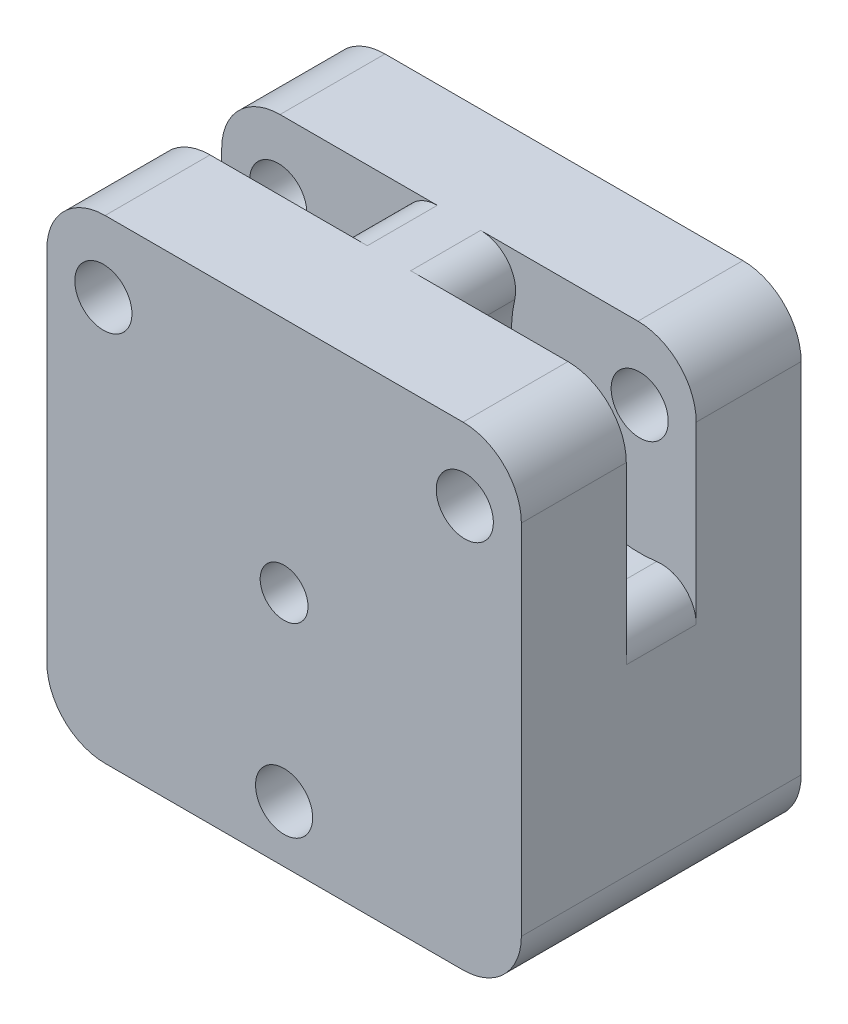
ISO-10303-21;
HEADER;
FILE_DESCRIPTION(('STEP AP214'),'2;1');
FILE_NAME('part.step','',(''),(''),'','','');
FILE_SCHEMA(('AUTOMOTIVE_DESIGN { 1 0 10303 214 1 1 1 1 }'));
ENDSEC;
DATA;
#1=APPLICATION_CONTEXT('core data for automotive mechanical design processes');
#2=APPLICATION_PROTOCOL_DEFINITION('international standard','automotive_design',2000,#1);
#3=PRODUCT_CONTEXT('',#1,'mechanical');
#4=PRODUCT('Part','Part','',(#3));
#5=PRODUCT_RELATED_PRODUCT_CATEGORY('part','',(#4));
#6=PRODUCT_DEFINITION_FORMATION('','',#4);
#7=PRODUCT_DEFINITION_CONTEXT('part definition',#1,'design');
#8=PRODUCT_DEFINITION('design','',#6,#7);
#9=PRODUCT_DEFINITION_SHAPE('','',#8);
#10=(LENGTH_UNIT() NAMED_UNIT(*) SI_UNIT(.MILLI.,.METRE.));
#11=(NAMED_UNIT(*) PLANE_ANGLE_UNIT() SI_UNIT($,.RADIAN.));
#12=(NAMED_UNIT(*) SI_UNIT($,.STERADIAN.) SOLID_ANGLE_UNIT());
#13=UNCERTAINTY_MEASURE_WITH_UNIT(LENGTH_MEASURE(1.E-05),#10,'distance_accuracy_value','');
#14=(GEOMETRIC_REPRESENTATION_CONTEXT(3) GLOBAL_UNCERTAINTY_ASSIGNED_CONTEXT((#13)) GLOBAL_UNIT_ASSIGNED_CONTEXT((#10,
#11,#12)) REPRESENTATION_CONTEXT('',''));
#15=CARTESIAN_POINT('',(0.,0.,0.));
#16=DIRECTION('',(0.,0.,1.));
#17=DIRECTION('',(1.,0.,0.));
#18=AXIS2_PLACEMENT_3D('',#15,#16,#17);
#19=CARTESIAN_POINT('',(0.,20.35,24.));
#20=DIRECTION('',(0.,1.,0.));
#21=DIRECTION('',(0.,0.,1.));
#22=AXIS2_PLACEMENT_3D('',#19,#20,#21);
#23=PLANE('',#22);
#24=DIRECTION('',(1.,0.,0.));
#25=VECTOR('',#24,1.);
#26=CARTESIAN_POINT('',(0.,20.35,9.));
#27=LINE('',#26,#25);
#28=CARTESIAN_POINT('',(-15.35,20.35,9.));
#29=VERTEX_POINT('',#28);
#30=CARTESIAN_POINT('',(-1.85886725659874,20.35,9.));
#31=VERTEX_POINT('',#30);
#32=EDGE_CURVE('E50',#29,#31,#27,.T.);
#33=ORIENTED_EDGE('',*,*,#32,.T.);
#34=DIRECTION('',(0.,0.,-1.));
#35=VECTOR('',#34,1.);
#36=CARTESIAN_POINT('',(-1.85886725659874,20.35,15.));
#37=LINE('',#36,#35);
#38=CARTESIAN_POINT('',(-1.85886725659874,20.35,15.));
#39=VERTEX_POINT('',#38);
#40=EDGE_CURVE('E298',#31,#39,#37,.F.);
#41=ORIENTED_EDGE('',*,*,#40,.T.);
#42=DIRECTION('',(1.,0.,0.));
#43=VECTOR('',#42,1.);
#44=CARTESIAN_POINT('',(0.,20.35,15.));
#45=LINE('',#44,#43);
#46=CARTESIAN_POINT('',(-15.35,20.35,15.));
#47=VERTEX_POINT('',#46);
#48=EDGE_CURVE('E58',#47,#39,#45,.T.);
#49=ORIENTED_EDGE('',*,*,#48,.F.);
#50=DIRECTION('',(0.,0.,-1.));
#51=VECTOR('',#50,1.);
#52=CARTESIAN_POINT('',(-15.35,20.35,24.));
#53=LINE('',#52,#51);
#54=CARTESIAN_POINT('',(-15.35,20.35,24.));
#55=VERTEX_POINT('',#54);
#56=EDGE_CURVE('E205',#55,#47,#53,.T.);
#57=ORIENTED_EDGE('',*,*,#56,.F.);
#58=DIRECTION('',(1.,0.,0.));
#59=VECTOR('',#58,1.);
#60=CARTESIAN_POINT('',(0.,20.35,24.));
#61=LINE('',#60,#59);
#62=CARTESIAN_POINT('',(15.35,20.35,24.));
#63=VERTEX_POINT('',#62);
#64=EDGE_CURVE('E348',#55,#63,#61,.T.);
#65=ORIENTED_EDGE('',*,*,#64,.T.);
#66=DIRECTION('',(0.,0.,-1.));
#67=VECTOR('',#66,1.);
#68=CARTESIAN_POINT('',(15.35,20.35,24.));
#69=LINE('',#68,#67);
#70=CARTESIAN_POINT('',(15.35,20.35,15.));
#71=VERTEX_POINT('',#70);
#72=EDGE_CURVE('E227',#63,#71,#69,.T.);
#73=ORIENTED_EDGE('',*,*,#72,.T.);
#74=DIRECTION('',(1.,0.,0.));
#75=VECTOR('',#74,1.);
#76=CARTESIAN_POINT('',(0.,20.35,15.));
#77=LINE('',#76,#75);
#78=CARTESIAN_POINT('',(1.85886725659874,20.35,15.));
#79=VERTEX_POINT('',#78);
#80=EDGE_CURVE('E200',#79,#71,#77,.T.);
#81=ORIENTED_EDGE('',*,*,#80,.F.);
#82=DIRECTION('',(0.,0.,-1.));
#83=VECTOR('',#82,1.);
#84=CARTESIAN_POINT('',(1.85886725659874,20.35,9.));
#85=LINE('',#84,#83);
#86=CARTESIAN_POINT('',(1.85886725659874,20.35,9.));
#87=VERTEX_POINT('',#86);
#88=EDGE_CURVE('E295',#79,#87,#85,.T.);
#89=ORIENTED_EDGE('',*,*,#88,.T.);
#90=DIRECTION('',(1.,0.,0.));
#91=VECTOR('',#90,1.);
#92=CARTESIAN_POINT('',(0.,20.35,9.));
#93=LINE('',#92,#91);
#94=CARTESIAN_POINT('',(15.35,20.35,9.));
#95=VERTEX_POINT('',#94);
#96=EDGE_CURVE('E331',#87,#95,#93,.T.);
#97=ORIENTED_EDGE('',*,*,#96,.T.);
#98=CARTESIAN_POINT('',(15.35,20.35,0.));
#99=VERTEX_POINT('',#98);
#100=EDGE_CURVE('E370',#95,#99,#69,.T.);
#101=ORIENTED_EDGE('',*,*,#100,.T.);
#102=DIRECTION('',(1.,0.,0.));
#103=VECTOR('',#102,1.);
#104=CARTESIAN_POINT('',(0.,20.35,0.));
#105=LINE('',#104,#103);
#106=CARTESIAN_POINT('',(-15.35,20.35,0.));
#107=VERTEX_POINT('',#106);
#108=EDGE_CURVE('E347',#107,#99,#105,.T.);
#109=ORIENTED_EDGE('',*,*,#108,.F.);
#110=EDGE_CURVE('E241',#29,#107,#53,.T.);
#111=ORIENTED_EDGE('',*,*,#110,.F.);
#112=EDGE_LOOP('',(#33,#41,#49,#57,#65,#73,#81,#89,#97,#101,#109,#111));
#113=FACE_BOUND('',#112,.T.);
#114=ADVANCED_FACE('F35',(#113),#23,.T.);
#115=CARTESIAN_POINT('',(-15.35,15.35,24.));
#116=DIRECTION('',(0.,0.,-1.));
#117=DIRECTION('',(-1.,0.,0.));
#118=AXIS2_PLACEMENT_3D('',#115,#116,#117);
#119=CYLINDRICAL_SURFACE('',#118,5.);
#120=DIRECTION('',(0.,0.,-1.));
#121=VECTOR('',#120,1.);
#122=CARTESIAN_POINT('',(-20.35,15.35,24.));
#123=LINE('',#122,#121);
#124=CARTESIAN_POINT('',(-20.35,15.35,9.));
#125=VERTEX_POINT('',#124);
#126=CARTESIAN_POINT('',(-20.35,15.35,0.));
#127=VERTEX_POINT('',#126);
#128=EDGE_CURVE('E237',#125,#127,#123,.T.);
#129=ORIENTED_EDGE('',*,*,#128,.F.);
#130=CARTESIAN_POINT('',(-15.35,15.35,9.));
#131=DIRECTION('',(0.,0.,1.));
#132=DIRECTION('',(1.,0.,0.));
#133=AXIS2_PLACEMENT_3D('',#130,#131,#132);
#134=CIRCLE('',#133,5.);
#135=EDGE_CURVE('E343',#125,#29,#134,.F.);
#136=ORIENTED_EDGE('',*,*,#135,.T.);
#137=ORIENTED_EDGE('',*,*,#110,.T.);
#138=CARTESIAN_POINT('',(-15.35,15.35,0.));
#139=DIRECTION('',(0.,0.,1.));
#140=DIRECTION('',(1.,0.,0.));
#141=AXIS2_PLACEMENT_3D('',#138,#139,#140);
#142=CIRCLE('',#141,5.);
#143=EDGE_CURVE('E373',#127,#107,#142,.F.);
#144=ORIENTED_EDGE('',*,*,#143,.F.);
#145=EDGE_LOOP('',(#129,#136,#137,#144));
#146=FACE_BOUND('',#145,.T.);
#147=ADVANCED_FACE('F412',(#146),#119,.T.);
#148=CARTESIAN_POINT('',(-20.35,0.,24.));
#149=DIRECTION('',(-1.,0.,0.));
#150=DIRECTION('',(0.,0.,1.));
#151=AXIS2_PLACEMENT_3D('',#148,#149,#150);
#152=PLANE('',#151);
#153=DIRECTION('',(0.,1.,0.));
#154=VECTOR('',#153,1.);
#155=CARTESIAN_POINT('',(-20.35,0.,15.));
#156=LINE('',#155,#154);
#157=CARTESIAN_POINT('',(-20.35,0.323247076428234,15.));
#158=VERTEX_POINT('',#157);
#159=CARTESIAN_POINT('',(-20.35,15.35,15.));
#160=VERTEX_POINT('',#159);
#161=EDGE_CURVE('E250',#158,#160,#156,.T.);
#162=ORIENTED_EDGE('',*,*,#161,.F.);
#163=DIRECTION('',(0.,0.,-1.));
#164=VECTOR('',#163,1.);
#165=CARTESIAN_POINT('',(-20.35,0.323247076428234,9.));
#166=LINE('',#165,#164);
#167=CARTESIAN_POINT('',(-20.35,0.323247076428234,9.));
#168=VERTEX_POINT('',#167);
#169=EDGE_CURVE('E286',#158,#168,#166,.T.);
#170=ORIENTED_EDGE('',*,*,#169,.T.);
#171=DIRECTION('',(0.,1.,0.));
#172=VECTOR('',#171,1.);
#173=CARTESIAN_POINT('',(-20.35,0.,9.));
#174=LINE('',#173,#172);
#175=EDGE_CURVE('E252',#168,#125,#174,.T.);
#176=ORIENTED_EDGE('',*,*,#175,.T.);
#177=ORIENTED_EDGE('',*,*,#128,.T.);
#178=DIRECTION('',(0.,1.,0.));
#179=VECTOR('',#178,1.);
#180=CARTESIAN_POINT('',(-20.35,0.,0.));
#181=LINE('',#180,#179);
#182=CARTESIAN_POINT('',(-20.35,-15.35,0.));
#183=VERTEX_POINT('',#182);
#184=EDGE_CURVE('E376',#183,#127,#181,.T.);
#185=ORIENTED_EDGE('',*,*,#184,.F.);
#186=DIRECTION('',(0.,0.,-1.));
#187=VECTOR('',#186,1.);
#188=CARTESIAN_POINT('',(-20.35,-15.35,24.));
#189=LINE('',#188,#187);
#190=CARTESIAN_POINT('',(-20.35,-15.35,24.));
#191=VERTEX_POINT('',#190);
#192=EDGE_CURVE('E235',#191,#183,#189,.T.);
#193=ORIENTED_EDGE('',*,*,#192,.F.);
#194=DIRECTION('',(0.,1.,0.));
#195=VECTOR('',#194,1.);
#196=CARTESIAN_POINT('',(-20.35,0.,24.));
#197=LINE('',#196,#195);
#198=CARTESIAN_POINT('',(-20.35,15.35,24.));
#199=VERTEX_POINT('',#198);
#200=EDGE_CURVE('E354',#191,#199,#197,.T.);
#201=ORIENTED_EDGE('',*,*,#200,.T.);
#202=EDGE_CURVE('E238',#199,#160,#123,.T.);
#203=ORIENTED_EDGE('',*,*,#202,.T.);
#204=EDGE_LOOP('',(#162,#170,#176,#177,#185,#193,#201,#203));
#205=FACE_BOUND('',#204,.T.);
#206=ADVANCED_FACE('F419',(#205),#152,.T.);
#207=CARTESIAN_POINT('',(0.,-20.35,24.));
#208=DIRECTION('',(0.,1.,0.));
#209=DIRECTION('',(0.,0.,1.));
#210=AXIS2_PLACEMENT_3D('',#207,#208,#209);
#211=PLANE('',#210);
#212=DIRECTION('',(1.,0.,0.));
#213=VECTOR('',#212,1.);
#214=CARTESIAN_POINT('',(0.,-20.35,0.));
#215=LINE('',#214,#213);
#216=CARTESIAN_POINT('',(-15.35,-20.35,0.));
#217=VERTEX_POINT('',#216);
#218=CARTESIAN_POINT('',(15.35,-20.35,0.));
#219=VERTEX_POINT('',#218);
#220=EDGE_CURVE('E382',#217,#219,#215,.T.);
#221=ORIENTED_EDGE('',*,*,#220,.T.);
#222=DIRECTION('',(0.,0.,-1.));
#223=VECTOR('',#222,1.);
#224=CARTESIAN_POINT('',(15.35,-20.35,24.));
#225=LINE('',#224,#223);
#226=CARTESIAN_POINT('',(15.35,-20.35,24.));
#227=VERTEX_POINT('',#226);
#228=EDGE_CURVE('E225',#227,#219,#225,.T.);
#229=ORIENTED_EDGE('',*,*,#228,.F.);
#230=DIRECTION('',(1.,0.,0.));
#231=VECTOR('',#230,1.);
#232=CARTESIAN_POINT('',(0.,-20.35,24.));
#233=LINE('',#232,#231);
#234=CARTESIAN_POINT('',(-15.35,-20.35,24.));
#235=VERTEX_POINT('',#234);
#236=EDGE_CURVE('E360',#235,#227,#233,.T.);
#237=ORIENTED_EDGE('',*,*,#236,.F.);
#238=DIRECTION('',(0.,0.,-1.));
#239=VECTOR('',#238,1.);
#240=CARTESIAN_POINT('',(-15.35,-20.35,24.));
#241=LINE('',#240,#239);
#242=EDGE_CURVE('E233',#235,#217,#241,.T.);
#243=ORIENTED_EDGE('',*,*,#242,.T.);
#244=EDGE_LOOP('',(#221,#229,#237,#243));
#245=FACE_BOUND('',#244,.T.);
#246=DIRECTION('',(0.,0.,1.));
#247=VECTOR('',#246,1.);
#248=CARTESIAN_POINT('',(-13.8772295505983,-20.35,24.));
#249=LINE('',#248,#247);
#250=CARTESIAN_POINT('',(-13.8772295505983,-20.35,9.));
#251=VERTEX_POINT('',#250);
#252=CARTESIAN_POINT('',(-13.8772295505983,-20.35,15.));
#253=VERTEX_POINT('',#252);
#254=EDGE_CURVE('E273',#251,#253,#249,.T.);
#255=ORIENTED_EDGE('',*,*,#254,.T.);
#256=DIRECTION('',(1.,0.,0.));
#257=VECTOR('',#256,1.);
#258=CARTESIAN_POINT('',(0.,-20.35,15.));
#259=LINE('',#258,#257);
#260=CARTESIAN_POINT('',(13.8772295505983,-20.35,15.));
#261=VERTEX_POINT('',#260);
#262=EDGE_CURVE('E246',#253,#261,#259,.T.);
#263=ORIENTED_EDGE('',*,*,#262,.T.);
#264=DIRECTION('',(0.,0.,1.));
#265=VECTOR('',#264,1.);
#266=CARTESIAN_POINT('',(13.8772295505983,-20.35,24.));
#267=LINE('',#266,#265);
#268=CARTESIAN_POINT('',(13.8772295505983,-20.35,9.));
#269=VERTEX_POINT('',#268);
#270=EDGE_CURVE('E255',#261,#269,#267,.F.);
#271=ORIENTED_EDGE('',*,*,#270,.T.);
#272=DIRECTION('',(1.,0.,0.));
#273=VECTOR('',#272,1.);
#274=CARTESIAN_POINT('',(0.,-20.35,9.));
#275=LINE('',#274,#273);
#276=EDGE_CURVE('E248',#251,#269,#275,.T.);
#277=ORIENTED_EDGE('',*,*,#276,.F.);
#278=EDGE_LOOP('',(#255,#263,#271,#277));
#279=FACE_BOUND('',#278,.T.);
#280=ADVANCED_FACE('F708',(#245,#279),#211,.F.);
#281=CARTESIAN_POINT('',(20.35,0.,24.));
#282=DIRECTION('',(-1.,0.,0.));
#283=DIRECTION('',(0.,0.,1.));
#284=AXIS2_PLACEMENT_3D('',#281,#282,#283);
#285=PLANE('',#284);
#286=DIRECTION('',(0.,0.,1.));
#287=VECTOR('',#286,1.);
#288=CARTESIAN_POINT('',(20.35,0.323247076428237,24.));
#289=LINE('',#288,#287);
#290=CARTESIAN_POINT('',(20.35,0.323247076428237,9.));
#291=VERTEX_POINT('',#290);
#292=CARTESIAN_POINT('',(20.35,0.323247076428237,15.));
#293=VERTEX_POINT('',#292);
#294=EDGE_CURVE('E215',#291,#293,#289,.T.);
#295=ORIENTED_EDGE('',*,*,#294,.T.);
#296=DIRECTION('',(0.,1.,0.));
#297=VECTOR('',#296,1.);
#298=CARTESIAN_POINT('',(20.35,0.,15.));
#299=LINE('',#298,#297);
#300=CARTESIAN_POINT('',(20.35,15.35,15.));
#301=VERTEX_POINT('',#300);
#302=EDGE_CURVE('E197',#293,#301,#299,.T.);
#303=ORIENTED_EDGE('',*,*,#302,.T.);
#304=DIRECTION('',(0.,0.,-1.));
#305=VECTOR('',#304,1.);
#306=CARTESIAN_POINT('',(20.35,15.35,24.));
#307=LINE('',#306,#305);
#308=CARTESIAN_POINT('',(20.35,15.35,24.));
#309=VERTEX_POINT('',#308);
#310=EDGE_CURVE('E212',#309,#301,#307,.T.);
#311=ORIENTED_EDGE('',*,*,#310,.F.);
#312=DIRECTION('',(0.,1.,0.));
#313=VECTOR('',#312,1.);
#314=CARTESIAN_POINT('',(20.35,0.,24.));
#315=LINE('',#314,#313);
#316=CARTESIAN_POINT('',(20.35,-15.35,24.));
#317=VERTEX_POINT('',#316);
#318=EDGE_CURVE('E364',#317,#309,#315,.T.);
#319=ORIENTED_EDGE('',*,*,#318,.F.);
#320=DIRECTION('',(0.,0.,-1.));
#321=VECTOR('',#320,1.);
#322=CARTESIAN_POINT('',(20.35,-15.35,24.));
#323=LINE('',#322,#321);
#324=CARTESIAN_POINT('',(20.35,-15.35,0.));
#325=VERTEX_POINT('',#324);
#326=EDGE_CURVE('E221',#317,#325,#323,.T.);
#327=ORIENTED_EDGE('',*,*,#326,.T.);
#328=DIRECTION('',(0.,1.,0.));
#329=VECTOR('',#328,1.);
#330=CARTESIAN_POINT('',(20.35,0.,0.));
#331=LINE('',#330,#329);
#332=CARTESIAN_POINT('',(20.35,15.35,0.));
#333=VERTEX_POINT('',#332);
#334=EDGE_CURVE('E386',#325,#333,#331,.T.);
#335=ORIENTED_EDGE('',*,*,#334,.T.);
#336=CARTESIAN_POINT('',(20.35,15.35,9.));
#337=VERTEX_POINT('',#336);
#338=EDGE_CURVE('E222',#337,#333,#307,.T.);
#339=ORIENTED_EDGE('',*,*,#338,.F.);
#340=DIRECTION('',(0.,1.,0.));
#341=VECTOR('',#340,1.);
#342=CARTESIAN_POINT('',(20.35,0.,9.));
#343=LINE('',#342,#341);
#344=EDGE_CURVE('E334',#291,#337,#343,.T.);
#345=ORIENTED_EDGE('',*,*,#344,.F.);
#346=EDGE_LOOP('',(#295,#303,#311,#319,#327,#335,#339,#345));
#347=FACE_BOUND('',#346,.T.);
#348=ADVANCED_FACE('F210',(#347),#285,.F.);
#349=CARTESIAN_POINT('',(15.35,15.35,24.));
#350=DIRECTION('',(0.,0.,-1.));
#351=DIRECTION('',(-1.,0.,0.));
#352=AXIS2_PLACEMENT_3D('',#349,#350,#351);
#353=CYLINDRICAL_SURFACE('',#352,5.);
#354=ORIENTED_EDGE('',*,*,#100,.F.);
#355=CARTESIAN_POINT('',(15.35,15.35,9.));
#356=DIRECTION('',(0.,0.,1.));
#357=DIRECTION('',(1.,0.,0.));
#358=AXIS2_PLACEMENT_3D('',#355,#356,#357);
#359=CIRCLE('',#358,5.);
#360=EDGE_CURVE('E204',#95,#337,#359,.F.);
#361=ORIENTED_EDGE('',*,*,#360,.T.);
#362=ORIENTED_EDGE('',*,*,#338,.T.);
#363=CARTESIAN_POINT('',(15.35,15.35,0.));
#364=DIRECTION('',(0.,0.,1.));
#365=DIRECTION('',(1.,0.,0.));
#366=AXIS2_PLACEMENT_3D('',#363,#364,#365);
#367=CIRCLE('',#366,5.);
#368=EDGE_CURVE('E389',#99,#333,#367,.F.);
#369=ORIENTED_EDGE('',*,*,#368,.F.);
#370=EDGE_LOOP('',(#354,#361,#362,#369));
#371=FACE_BOUND('',#370,.T.);
#372=ADVANCED_FACE('F409',(#371),#353,.T.);
#373=CARTESIAN_POINT('',(-15.35,15.35,15.));
#374=DIRECTION('',(0.,0.,1.));
#375=DIRECTION('',(1.,0.,0.));
#376=AXIS2_PLACEMENT_3D('',#373,#374,#375);
#377=CIRCLE('',#376,5.);
#378=EDGE_CURVE('E340',#160,#47,#377,.F.);
#379=ORIENTED_EDGE('',*,*,#378,.F.);
#380=ORIENTED_EDGE('',*,*,#202,.F.);
#381=CARTESIAN_POINT('',(-15.35,15.35,24.));
#382=DIRECTION('',(0.,0.,1.));
#383=DIRECTION('',(1.,0.,0.));
#384=AXIS2_PLACEMENT_3D('',#381,#382,#383);
#385=CIRCLE('',#384,5.);
#386=EDGE_CURVE('E350',#199,#55,#385,.F.);
#387=ORIENTED_EDGE('',*,*,#386,.T.);
#388=ORIENTED_EDGE('',*,*,#56,.T.);
#389=EDGE_LOOP('',(#379,#380,#387,#388));
#390=FACE_BOUND('',#389,.T.);
#391=ADVANCED_FACE('F422',(#390),#119,.T.);
#392=CARTESIAN_POINT('',(-15.35,-15.35,24.));
#393=DIRECTION('',(0.,0.,-1.));
#394=DIRECTION('',(-1.,0.,0.));
#395=AXIS2_PLACEMENT_3D('',#392,#393,#394);
#396=CYLINDRICAL_SURFACE('',#395,5.);
#397=CARTESIAN_POINT('',(-15.35,-15.35,0.));
#398=DIRECTION('',(0.,0.,1.));
#399=DIRECTION('',(1.,0.,0.));
#400=AXIS2_PLACEMENT_3D('',#397,#398,#399);
#401=CIRCLE('',#400,5.);
#402=EDGE_CURVE('E379',#217,#183,#401,.F.);
#403=ORIENTED_EDGE('',*,*,#402,.F.);
#404=ORIENTED_EDGE('',*,*,#242,.F.);
#405=CARTESIAN_POINT('',(-15.35,-15.35,24.));
#406=DIRECTION('',(0.,0.,1.));
#407=DIRECTION('',(1.,0.,0.));
#408=AXIS2_PLACEMENT_3D('',#405,#406,#407);
#409=CIRCLE('',#408,5.);
#410=EDGE_CURVE('E357',#235,#191,#409,.F.);
#411=ORIENTED_EDGE('',*,*,#410,.T.);
#412=ORIENTED_EDGE('',*,*,#192,.T.);
#413=EDGE_LOOP('',(#403,#404,#411,#412));
#414=FACE_BOUND('',#413,.T.);
#415=ADVANCED_FACE('F703',(#414),#396,.T.);
#416=CARTESIAN_POINT('',(15.35,-15.35,24.));
#417=DIRECTION('',(0.,0.,-1.));
#418=DIRECTION('',(-1.,0.,0.));
#419=AXIS2_PLACEMENT_3D('',#416,#417,#418);
#420=CYLINDRICAL_SURFACE('',#419,5.);
#421=CARTESIAN_POINT('',(15.35,-15.35,0.));
#422=DIRECTION('',(0.,0.,1.));
#423=DIRECTION('',(1.,0.,0.));
#424=AXIS2_PLACEMENT_3D('',#421,#422,#423);
#425=CIRCLE('',#424,5.);
#426=EDGE_CURVE('E384',#219,#325,#425,.T.);
#427=ORIENTED_EDGE('',*,*,#426,.T.);
#428=ORIENTED_EDGE('',*,*,#326,.F.);
#429=CARTESIAN_POINT('',(15.35,-15.35,24.));
#430=DIRECTION('',(0.,0.,1.));
#431=DIRECTION('',(1.,0.,0.));
#432=AXIS2_PLACEMENT_3D('',#429,#430,#431);
#433=CIRCLE('',#432,5.);
#434=EDGE_CURVE('E362',#227,#317,#433,.T.);
#435=ORIENTED_EDGE('',*,*,#434,.F.);
#436=ORIENTED_EDGE('',*,*,#228,.T.);
#437=EDGE_LOOP('',(#427,#428,#435,#436));
#438=FACE_BOUND('',#437,.T.);
#439=ADVANCED_FACE('F407',(#438),#420,.T.);
#440=CARTESIAN_POINT('',(15.35,15.35,15.));
#441=DIRECTION('',(0.,0.,1.));
#442=DIRECTION('',(1.,0.,0.));
#443=AXIS2_PLACEMENT_3D('',#440,#441,#442);
#444=CIRCLE('',#443,5.);
#445=EDGE_CURVE('E194',#71,#301,#444,.F.);
#446=ORIENTED_EDGE('',*,*,#445,.F.);
#447=ORIENTED_EDGE('',*,*,#72,.F.);
#448=CARTESIAN_POINT('',(15.35,15.35,24.));
#449=DIRECTION('',(0.,0.,1.));
#450=DIRECTION('',(1.,0.,0.));
#451=AXIS2_PLACEMENT_3D('',#448,#449,#450);
#452=CIRCLE('',#451,5.);
#453=EDGE_CURVE('E220',#63,#309,#452,.F.);
#454=ORIENTED_EDGE('',*,*,#453,.T.);
#455=ORIENTED_EDGE('',*,*,#310,.T.);
#456=EDGE_LOOP('',(#446,#447,#454,#455));
#457=FACE_BOUND('',#456,.T.);
#458=ADVANCED_FACE('F218',(#457),#353,.T.);
#459=CARTESIAN_POINT('',(0.,0.,24.));
#460=DIRECTION('',(0.,0.,-1.));
#461=DIRECTION('',(-1.,0.,0.));
#462=AXIS2_PLACEMENT_3D('',#459,#460,#461);
#463=CYLINDRICAL_SURFACE('',#462,2.05);
#464=CARTESIAN_POINT('',(0.,0.,24.));
#465=DIRECTION('',(0.,0.,1.));
#466=DIRECTION('',(1.,0.,0.));
#467=AXIS2_PLACEMENT_3D('',#464,#465,#466);
#468=CIRCLE('',#467,2.05);
#469=CARTESIAN_POINT('',(2.05,0.,24.));
#470=VERTEX_POINT('',#469);
#471=EDGE_CURVE('E367',#470,#470,#468,.T.);
#472=ORIENTED_EDGE('',*,*,#471,.T.);
#473=EDGE_LOOP('',(#472));
#474=FACE_BOUND('',#473,.T.);
#475=CARTESIAN_POINT('',(0.,0.,0.));
#476=DIRECTION('',(0.,0.,1.));
#477=DIRECTION('',(1.,0.,0.));
#478=AXIS2_PLACEMENT_3D('',#475,#476,#477);
#479=CIRCLE('',#478,2.05);
#480=CARTESIAN_POINT('',(2.05,0.,0.));
#481=VERTEX_POINT('',#480);
#482=EDGE_CURVE('E351',#481,#481,#479,.T.);
#483=ORIENTED_EDGE('',*,*,#482,.F.);
#484=EDGE_LOOP('',(#483));
#485=FACE_BOUND('',#484,.T.);
#486=ADVANCED_FACE('F396',(#474,#485),#463,.F.);
#487=CARTESIAN_POINT('',(0.,0.,24.));
#488=DIRECTION('',(0.,0.,1.));
#489=DIRECTION('',(1.,0.,0.));
#490=AXIS2_PLACEMENT_3D('',#487,#488,#489);
#491=PLANE('',#490);
#492=CARTESIAN_POINT('',(-15.5,14.2004766270266,24.));
#493=DIRECTION('',(0.,0.,1.));
#494=DIRECTION('',(1.,0.,0.));
#495=AXIS2_PLACEMENT_3D('',#492,#493,#494);
#496=CIRCLE('',#495,2.45);
#497=CARTESIAN_POINT('',(-13.05,14.2004766270266,24.));
#498=VERTEX_POINT('',#497);
#499=EDGE_CURVE('E265',#498,#498,#496,.F.);
#500=ORIENTED_EDGE('',*,*,#499,.T.);
#501=EDGE_LOOP('',(#500));
#502=FACE_BOUND('',#501,.T.);
#503=CARTESIAN_POINT('',(0.,-15.5,24.));
#504=DIRECTION('',(0.,0.,1.));
#505=DIRECTION('',(1.,0.,0.));
#506=AXIS2_PLACEMENT_3D('',#503,#504,#505);
#507=CIRCLE('',#506,2.45);
#508=CARTESIAN_POINT('',(2.45,-15.5,24.));
#509=VERTEX_POINT('',#508);
#510=EDGE_CURVE('E270',#509,#509,#507,.F.);
#511=ORIENTED_EDGE('',*,*,#510,.T.);
#512=EDGE_LOOP('',(#511));
#513=FACE_BOUND('',#512,.T.);
#514=CARTESIAN_POINT('',(15.5,14.2004766270266,24.));
#515=DIRECTION('',(0.,0.,1.));
#516=DIRECTION('',(1.,0.,0.));
#517=AXIS2_PLACEMENT_3D('',#514,#515,#516);
#518=CIRCLE('',#517,2.45000000000001);
#519=CARTESIAN_POINT('',(17.95,14.2004766270266,24.));
#520=VERTEX_POINT('',#519);
#521=EDGE_CURVE('E468',#520,#520,#518,.F.);
#522=ORIENTED_EDGE('',*,*,#521,.T.);
#523=EDGE_LOOP('',(#522));
#524=FACE_BOUND('',#523,.T.);
#525=ORIENTED_EDGE('',*,*,#64,.F.);
#526=ORIENTED_EDGE('',*,*,#386,.F.);
#527=ORIENTED_EDGE('',*,*,#200,.F.);
#528=ORIENTED_EDGE('',*,*,#410,.F.);
#529=ORIENTED_EDGE('',*,*,#236,.T.);
#530=ORIENTED_EDGE('',*,*,#434,.T.);
#531=ORIENTED_EDGE('',*,*,#318,.T.);
#532=ORIENTED_EDGE('',*,*,#453,.F.);
#533=EDGE_LOOP('',(#525,#526,#527,#528,#529,#530,#531,#532));
#534=FACE_BOUND('',#533,.T.);
#535=ORIENTED_EDGE('',*,*,#471,.F.);
#536=EDGE_LOOP('',(#535));
#537=FACE_BOUND('',#536,.T.);
#538=ADVANCED_FACE('F398',(#502,#513,#524,#534,#537),#491,.T.);
#539=CARTESIAN_POINT('',(0.,0.,0.));
#540=DIRECTION('',(0.,0.,1.));
#541=DIRECTION('',(1.,0.,0.));
#542=AXIS2_PLACEMENT_3D('',#539,#540,#541);
#543=PLANE('',#542);
#544=CARTESIAN_POINT('',(-15.5,14.2004766270266,0.));
#545=DIRECTION('',(0.,0.,1.));
#546=DIRECTION('',(1.,0.,0.));
#547=AXIS2_PLACEMENT_3D('',#544,#545,#546);
#548=CIRCLE('',#547,2.45);
#549=CARTESIAN_POINT('',(-13.05,14.2004766270266,0.));
#550=VERTEX_POINT('',#549);
#551=EDGE_CURVE('E260',#550,#550,#548,.T.);
#552=ORIENTED_EDGE('',*,*,#551,.T.);
#553=EDGE_LOOP('',(#552));
#554=FACE_BOUND('',#553,.T.);
#555=CARTESIAN_POINT('',(0.,-15.5,0.));
#556=DIRECTION('',(0.,0.,1.));
#557=DIRECTION('',(1.,0.,0.));
#558=AXIS2_PLACEMENT_3D('',#555,#556,#557);
#559=CIRCLE('',#558,2.45);
#560=CARTESIAN_POINT('',(2.45,-15.5,0.));
#561=VERTEX_POINT('',#560);
#562=EDGE_CURVE('E487',#561,#561,#559,.T.);
#563=ORIENTED_EDGE('',*,*,#562,.T.);
#564=EDGE_LOOP('',(#563));
#565=FACE_BOUND('',#564,.T.);
#566=CARTESIAN_POINT('',(15.5,14.2004766270266,0.));
#567=DIRECTION('',(0.,0.,1.));
#568=DIRECTION('',(1.,0.,0.));
#569=AXIS2_PLACEMENT_3D('',#566,#567,#568);
#570=CIRCLE('',#569,2.45000000000001);
#571=CARTESIAN_POINT('',(17.95,14.2004766270266,0.));
#572=VERTEX_POINT('',#571);
#573=EDGE_CURVE('E484',#572,#572,#570,.T.);
#574=ORIENTED_EDGE('',*,*,#573,.T.);
#575=EDGE_LOOP('',(#574));
#576=FACE_BOUND('',#575,.T.);
#577=ORIENTED_EDGE('',*,*,#108,.T.);
#578=ORIENTED_EDGE('',*,*,#368,.T.);
#579=ORIENTED_EDGE('',*,*,#334,.F.);
#580=ORIENTED_EDGE('',*,*,#426,.F.);
#581=ORIENTED_EDGE('',*,*,#220,.F.);
#582=ORIENTED_EDGE('',*,*,#402,.T.);
#583=ORIENTED_EDGE('',*,*,#184,.T.);
#584=ORIENTED_EDGE('',*,*,#143,.T.);
#585=EDGE_LOOP('',(#577,#578,#579,#580,#581,#582,#583,#584));
#586=FACE_BOUND('',#585,.T.);
#587=ORIENTED_EDGE('',*,*,#482,.T.);
#588=EDGE_LOOP('',(#587));
#589=FACE_BOUND('',#588,.T.);
#590=ADVANCED_FACE('F394',(#554,#565,#576,#586,#589),#543,.F.);
#591=CARTESIAN_POINT('',(15.5,14.2004766270266,9.));
#592=DIRECTION('',(0.,0.,1.));
#593=DIRECTION('',(1.,0.,0.));
#594=AXIS2_PLACEMENT_3D('',#591,#592,#593);
#595=CYLINDRICAL_SURFACE('',#594,11.);
#596=CARTESIAN_POINT('',(15.5,14.2004766270266,15.));
#597=DIRECTION('',(0.,0.,1.));
#598=DIRECTION('',(1.,0.,0.));
#599=AXIS2_PLACEMENT_3D('',#596,#597,#598);
#600=CIRCLE('',#599,11.);
#601=CARTESIAN_POINT('',(4.78196713018472,16.6751021343628,15.));
#602=VERTEX_POINT('',#601);
#603=CARTESIAN_POINT('',(16.9535714285714,3.29693912298503,15.));
#604=VERTEX_POINT('',#603);
#605=EDGE_CURVE('E326',#602,#604,#600,.T.);
#606=ORIENTED_EDGE('',*,*,#605,.T.);
#607=DIRECTION('',(0.,0.,1.));
#608=VECTOR('',#607,1.);
#609=CARTESIAN_POINT('',(16.9535714285714,3.29693912298503,9.));
#610=LINE('',#609,#608);
#611=CARTESIAN_POINT('',(16.9535714285714,3.29693912298503,9.));
#612=VERTEX_POINT('',#611);
#613=EDGE_CURVE('E293',#604,#612,#610,.F.);
#614=ORIENTED_EDGE('',*,*,#613,.T.);
#615=CARTESIAN_POINT('',(15.5,14.2004766270266,9.));
#616=DIRECTION('',(0.,0.,1.));
#617=DIRECTION('',(1.,0.,0.));
#618=AXIS2_PLACEMENT_3D('',#615,#616,#617);
#619=CIRCLE('',#618,11.);
#620=CARTESIAN_POINT('',(4.78196713018472,16.6751021343628,9.));
#621=VERTEX_POINT('',#620);
#622=EDGE_CURVE('E459',#621,#612,#619,.T.);
#623=ORIENTED_EDGE('',*,*,#622,.F.);
#624=DIRECTION('',(0.,0.,1.));
#625=VECTOR('',#624,1.);
#626=CARTESIAN_POINT('',(4.78196713018472,16.6751021343628,9.));
#627=LINE('',#626,#625);
#628=EDGE_CURVE('E290',#621,#602,#627,.T.);
#629=ORIENTED_EDGE('',*,*,#628,.T.);
#630=EDGE_LOOP('',(#606,#614,#623,#629));
#631=FACE_BOUND('',#630,.T.);
#632=ADVANCED_FACE('F520',(#631),#595,.F.);
#633=CARTESIAN_POINT('',(0.,0.,9.));
#634=DIRECTION('',(0.,0.,1.));
#635=DIRECTION('',(1.,0.,0.));
#636=AXIS2_PLACEMENT_3D('',#633,#634,#635);
#637=PLANE('',#636);
#638=CARTESIAN_POINT('',(15.5,14.2004766270266,9.));
#639=DIRECTION('',(0.,0.,1.));
#640=DIRECTION('',(1.,0.,0.));
#641=AXIS2_PLACEMENT_3D('',#638,#639,#640);
#642=CIRCLE('',#641,2.45000000000001);
#643=CARTESIAN_POINT('',(17.95,14.2004766270266,9.));
#644=VERTEX_POINT('',#643);
#645=EDGE_CURVE('E269',#644,#644,#642,.F.);
#646=ORIENTED_EDGE('',*,*,#645,.T.);
#647=EDGE_LOOP('',(#646));
#648=FACE_BOUND('',#647,.T.);
#649=ORIENTED_EDGE('',*,*,#96,.F.);
#650=CARTESIAN_POINT('',(1.85886725659874,17.35,9.));
#651=DIRECTION('',(0.,0.,1.));
#652=DIRECTION('',(1.,0.,0.));
#653=AXIS2_PLACEMENT_3D('',#650,#651,#652);
#654=CIRCLE('',#653,3.);
#655=EDGE_CURVE('E11',#87,#621,#654,.F.);
#656=ORIENTED_EDGE('',*,*,#655,.T.);
#657=ORIENTED_EDGE('',*,*,#622,.T.);
#658=CARTESIAN_POINT('',(17.35,0.323247076428237,9.));
#659=DIRECTION('',(0.,0.,1.));
#660=DIRECTION('',(1.,0.,0.));
#661=AXIS2_PLACEMENT_3D('',#658,#659,#660);
#662=CIRCLE('',#661,3.);
#663=EDGE_CURVE('E317',#612,#291,#662,.F.);
#664=ORIENTED_EDGE('',*,*,#663,.T.);
#665=ORIENTED_EDGE('',*,*,#344,.T.);
#666=ORIENTED_EDGE('',*,*,#360,.F.);
#667=EDGE_LOOP('',(#649,#656,#657,#664,#665,#666));
#668=FACE_BOUND('',#667,.T.);
#669=ADVANCED_FACE('F517',(#648,#668),#637,.T.);
#670=CARTESIAN_POINT('',(0.,0.,15.));
#671=DIRECTION('',(0.,0.,1.));
#672=DIRECTION('',(1.,0.,0.));
#673=AXIS2_PLACEMENT_3D('',#670,#671,#672);
#674=PLANE('',#673);
#675=CARTESIAN_POINT('',(15.5,14.2004766270266,15.));
#676=DIRECTION('',(0.,0.,1.));
#677=DIRECTION('',(1.,0.,0.));
#678=AXIS2_PLACEMENT_3D('',#675,#676,#677);
#679=CIRCLE('',#678,2.45000000000001);
#680=CARTESIAN_POINT('',(17.95,14.2004766270266,15.));
#681=VERTEX_POINT('',#680);
#682=EDGE_CURVE('E266',#681,#681,#679,.F.);
#683=ORIENTED_EDGE('',*,*,#682,.F.);
#684=EDGE_LOOP('',(#683));
#685=FACE_BOUND('',#684,.T.);
#686=ORIENTED_EDGE('',*,*,#80,.T.);
#687=ORIENTED_EDGE('',*,*,#445,.T.);
#688=ORIENTED_EDGE('',*,*,#302,.F.);
#689=CARTESIAN_POINT('',(17.35,0.323247076428237,15.));
#690=DIRECTION('',(0.,0.,1.));
#691=DIRECTION('',(1.,0.,0.));
#692=AXIS2_PLACEMENT_3D('',#689,#690,#691);
#693=CIRCLE('',#692,3.);
#694=EDGE_CURVE('E315',#293,#604,#693,.T.);
#695=ORIENTED_EDGE('',*,*,#694,.T.);
#696=ORIENTED_EDGE('',*,*,#605,.F.);
#697=CARTESIAN_POINT('',(1.85886725659874,17.35,15.));
#698=DIRECTION('',(0.,0.,1.));
#699=DIRECTION('',(1.,0.,0.));
#700=AXIS2_PLACEMENT_3D('',#697,#698,#699);
#701=CIRCLE('',#700,3.);
#702=EDGE_CURVE('E43',#602,#79,#701,.T.);
#703=ORIENTED_EDGE('',*,*,#702,.T.);
#704=EDGE_LOOP('',(#686,#687,#688,#695,#696,#703));
#705=FACE_BOUND('',#704,.T.);
#706=ADVANCED_FACE('F196',(#685,#705),#674,.F.);
#707=CARTESIAN_POINT('',(0.,-15.5,9.));
#708=DIRECTION('',(0.,0.,1.));
#709=DIRECTION('',(1.,0.,0.));
#710=AXIS2_PLACEMENT_3D('',#707,#708,#709);
#711=CYLINDRICAL_SURFACE('',#710,11.);
#712=CARTESIAN_POINT('',(0.,-15.5,15.));
#713=DIRECTION('',(0.,0.,1.));
#714=DIRECTION('',(1.,0.,0.));
#715=AXIS2_PLACEMENT_3D('',#712,#713,#714);
#716=CIRCLE('',#715,11.);
#717=CARTESIAN_POINT('',(10.9035375040416,-16.9535714285714,15.));
#718=VERTEX_POINT('',#717);
#719=CARTESIAN_POINT('',(-10.9035375040416,-16.9535714285714,15.));
#720=VERTEX_POINT('',#719);
#721=EDGE_CURVE('E464',#718,#720,#716,.T.);
#722=ORIENTED_EDGE('',*,*,#721,.T.);
#723=DIRECTION('',(0.,0.,1.));
#724=VECTOR('',#723,1.);
#725=CARTESIAN_POINT('',(-10.9035375040416,-16.9535714285714,9.));
#726=LINE('',#725,#724);
#727=CARTESIAN_POINT('',(-10.9035375040416,-16.9535714285714,9.));
#728=VERTEX_POINT('',#727);
#729=EDGE_CURVE('E278',#720,#728,#726,.F.);
#730=ORIENTED_EDGE('',*,*,#729,.T.);
#731=CARTESIAN_POINT('',(0.,-15.5,9.));
#732=DIRECTION('',(0.,0.,1.));
#733=DIRECTION('',(1.,0.,0.));
#734=AXIS2_PLACEMENT_3D('',#731,#732,#733);
#735=CIRCLE('',#734,11.);
#736=CARTESIAN_POINT('',(10.9035375040416,-16.9535714285714,9.));
#737=VERTEX_POINT('',#736);
#738=EDGE_CURVE('E467',#737,#728,#735,.T.);
#739=ORIENTED_EDGE('',*,*,#738,.F.);
#740=DIRECTION('',(0.,0.,1.));
#741=VECTOR('',#740,1.);
#742=CARTESIAN_POINT('',(10.9035375040416,-16.9535714285714,9.));
#743=LINE('',#742,#741);
#744=EDGE_CURVE('E276',#737,#718,#743,.T.);
#745=ORIENTED_EDGE('',*,*,#744,.T.);
#746=EDGE_LOOP('',(#722,#730,#739,#745));
#747=FACE_BOUND('',#746,.T.);
#748=ADVANCED_FACE('F524',(#747),#711,.F.);
#749=CARTESIAN_POINT('',(0.,0.,9.));
#750=DIRECTION('',(0.,0.,1.));
#751=DIRECTION('',(1.,0.,0.));
#752=AXIS2_PLACEMENT_3D('',#749,#750,#751);
#753=PLANE('',#752);
#754=CARTESIAN_POINT('',(0.,-15.5,9.));
#755=DIRECTION('',(0.,0.,1.));
#756=DIRECTION('',(1.,0.,0.));
#757=AXIS2_PLACEMENT_3D('',#754,#755,#756);
#758=CIRCLE('',#757,2.45);
#759=CARTESIAN_POINT('',(2.45,-15.5,9.));
#760=VERTEX_POINT('',#759);
#761=EDGE_CURVE('E264',#760,#760,#758,.F.);
#762=ORIENTED_EDGE('',*,*,#761,.T.);
#763=EDGE_LOOP('',(#762));
#764=FACE_BOUND('',#763,.T.);
#765=ORIENTED_EDGE('',*,*,#276,.T.);
#766=CARTESIAN_POINT('',(13.8772295505983,-17.35,9.));
#767=DIRECTION('',(0.,0.,1.));
#768=DIRECTION('',(1.,0.,0.));
#769=AXIS2_PLACEMENT_3D('',#766,#767,#768);
#770=CIRCLE('',#769,3.);
#771=EDGE_CURVE('E305',#269,#737,#770,.F.);
#772=ORIENTED_EDGE('',*,*,#771,.T.);
#773=ORIENTED_EDGE('',*,*,#738,.T.);
#774=CARTESIAN_POINT('',(-13.8772295505983,-17.35,9.));
#775=DIRECTION('',(0.,0.,1.));
#776=DIRECTION('',(1.,0.,0.));
#777=AXIS2_PLACEMENT_3D('',#774,#775,#776);
#778=CIRCLE('',#777,3.);
#779=EDGE_CURVE('E302',#728,#251,#778,.F.);
#780=ORIENTED_EDGE('',*,*,#779,.T.);
#781=EDGE_LOOP('',(#765,#772,#773,#780));
#782=FACE_BOUND('',#781,.T.);
#783=ADVANCED_FACE('F529',(#764,#782),#753,.T.);
#784=CARTESIAN_POINT('',(0.,0.,15.));
#785=DIRECTION('',(0.,0.,1.));
#786=DIRECTION('',(1.,0.,0.));
#787=AXIS2_PLACEMENT_3D('',#784,#785,#786);
#788=PLANE('',#787);
#789=CARTESIAN_POINT('',(0.,-15.5,15.));
#790=DIRECTION('',(0.,0.,1.));
#791=DIRECTION('',(1.,0.,0.));
#792=AXIS2_PLACEMENT_3D('',#789,#790,#791);
#793=CIRCLE('',#792,2.45);
#794=CARTESIAN_POINT('',(2.45,-15.5,15.));
#795=VERTEX_POINT('',#794);
#796=EDGE_CURVE('E261',#795,#795,#793,.F.);
#797=ORIENTED_EDGE('',*,*,#796,.F.);
#798=EDGE_LOOP('',(#797));
#799=FACE_BOUND('',#798,.T.);
#800=ORIENTED_EDGE('',*,*,#721,.F.);
#801=CARTESIAN_POINT('',(13.8772295505983,-17.35,15.));
#802=DIRECTION('',(0.,0.,1.));
#803=DIRECTION('',(1.,0.,0.));
#804=AXIS2_PLACEMENT_3D('',#801,#802,#803);
#805=CIRCLE('',#804,3.);
#806=EDGE_CURVE('E307',#718,#261,#805,.T.);
#807=ORIENTED_EDGE('',*,*,#806,.T.);
#808=ORIENTED_EDGE('',*,*,#262,.F.);
#809=CARTESIAN_POINT('',(-13.8772295505983,-17.35,15.));
#810=DIRECTION('',(0.,0.,1.));
#811=DIRECTION('',(1.,0.,0.));
#812=AXIS2_PLACEMENT_3D('',#809,#810,#811);
#813=CIRCLE('',#812,3.);
#814=EDGE_CURVE('E300',#253,#720,#813,.T.);
#815=ORIENTED_EDGE('',*,*,#814,.T.);
#816=EDGE_LOOP('',(#800,#807,#808,#815));
#817=FACE_BOUND('',#816,.T.);
#818=ADVANCED_FACE('F532',(#799,#817),#788,.F.);
#819=CARTESIAN_POINT('',(-15.5,14.2004766270266,9.));
#820=DIRECTION('',(0.,0.,1.));
#821=DIRECTION('',(1.,0.,0.));
#822=AXIS2_PLACEMENT_3D('',#819,#820,#821);
#823=CYLINDRICAL_SURFACE('',#822,11.);
#824=CARTESIAN_POINT('',(-15.5,14.2004766270266,9.));
#825=DIRECTION('',(0.,0.,1.));
#826=DIRECTION('',(1.,0.,0.));
#827=AXIS2_PLACEMENT_3D('',#824,#825,#826);
#828=CIRCLE('',#827,11.);
#829=CARTESIAN_POINT('',(-16.9535714285714,3.29693912298502,9.));
#830=VERTEX_POINT('',#829);
#831=CARTESIAN_POINT('',(-4.78196713018472,16.6751021343628,9.));
#832=VERTEX_POINT('',#831);
#833=EDGE_CURVE('E216',#830,#832,#828,.T.);
#834=ORIENTED_EDGE('',*,*,#833,.F.);
#835=DIRECTION('',(0.,0.,1.));
#836=VECTOR('',#835,1.);
#837=CARTESIAN_POINT('',(-16.9535714285714,3.29693912298502,9.));
#838=LINE('',#837,#836);
#839=CARTESIAN_POINT('',(-16.9535714285714,3.29693912298502,15.));
#840=VERTEX_POINT('',#839);
#841=EDGE_CURVE('E283',#830,#840,#838,.T.);
#842=ORIENTED_EDGE('',*,*,#841,.T.);
#843=CARTESIAN_POINT('',(-15.5,14.2004766270266,15.));
#844=DIRECTION('',(0.,0.,1.));
#845=DIRECTION('',(1.,0.,0.));
#846=AXIS2_PLACEMENT_3D('',#843,#844,#845);
#847=CIRCLE('',#846,11.);
#848=CARTESIAN_POINT('',(-4.78196713018472,16.6751021343628,15.));
#849=VERTEX_POINT('',#848);
#850=EDGE_CURVE('E453',#840,#849,#847,.T.);
#851=ORIENTED_EDGE('',*,*,#850,.T.);
#852=DIRECTION('',(0.,0.,1.));
#853=VECTOR('',#852,1.);
#854=CARTESIAN_POINT('',(-4.78196713018472,16.6751021343628,9.));
#855=LINE('',#854,#853);
#856=EDGE_CURVE('E280',#849,#832,#855,.F.);
#857=ORIENTED_EDGE('',*,*,#856,.T.);
#858=EDGE_LOOP('',(#834,#842,#851,#857));
#859=FACE_BOUND('',#858,.T.);
#860=ADVANCED_FACE('F456',(#859),#823,.F.);
#861=CARTESIAN_POINT('',(0.,0.,9.));
#862=DIRECTION('',(0.,0.,1.));
#863=DIRECTION('',(1.,0.,0.));
#864=AXIS2_PLACEMENT_3D('',#861,#862,#863);
#865=PLANE('',#864);
#866=CARTESIAN_POINT('',(-15.5,14.2004766270266,9.));
#867=DIRECTION('',(0.,0.,1.));
#868=DIRECTION('',(1.,0.,0.));
#869=AXIS2_PLACEMENT_3D('',#866,#867,#868);
#870=CIRCLE('',#869,2.45);
#871=CARTESIAN_POINT('',(-13.05,14.2004766270266,9.));
#872=VERTEX_POINT('',#871);
#873=EDGE_CURVE('E259',#872,#872,#870,.F.);
#874=ORIENTED_EDGE('',*,*,#873,.T.);
#875=EDGE_LOOP('',(#874));
#876=FACE_BOUND('',#875,.T.);
#877=ORIENTED_EDGE('',*,*,#135,.F.);
#878=ORIENTED_EDGE('',*,*,#175,.F.);
#879=CARTESIAN_POINT('',(-17.35,0.323247076428234,9.));
#880=DIRECTION('',(0.,0.,1.));
#881=DIRECTION('',(1.,0.,0.));
#882=AXIS2_PLACEMENT_3D('',#879,#880,#881);
#883=CIRCLE('',#882,3.);
#884=EDGE_CURVE('E313',#168,#830,#883,.F.);
#885=ORIENTED_EDGE('',*,*,#884,.T.);
#886=ORIENTED_EDGE('',*,*,#833,.T.);
#887=CARTESIAN_POINT('',(-1.85886725659874,17.35,9.));
#888=DIRECTION('',(0.,0.,1.));
#889=DIRECTION('',(1.,0.,0.));
#890=AXIS2_PLACEMENT_3D('',#887,#888,#889);
#891=CIRCLE('',#890,3.);
#892=EDGE_CURVE('E320',#832,#31,#891,.F.);
#893=ORIENTED_EDGE('',*,*,#892,.T.);
#894=ORIENTED_EDGE('',*,*,#32,.F.);
#895=EDGE_LOOP('',(#877,#878,#885,#886,#893,#894));
#896=FACE_BOUND('',#895,.T.);
#897=ADVANCED_FACE('F540',(#876,#896),#865,.T.);
#898=CARTESIAN_POINT('',(0.,0.,15.));
#899=DIRECTION('',(0.,0.,1.));
#900=DIRECTION('',(1.,0.,0.));
#901=AXIS2_PLACEMENT_3D('',#898,#899,#900);
#902=PLANE('',#901);
#903=CARTESIAN_POINT('',(-15.5,14.2004766270266,15.));
#904=DIRECTION('',(0.,0.,1.));
#905=DIRECTION('',(1.,0.,0.));
#906=AXIS2_PLACEMENT_3D('',#903,#904,#905);
#907=CIRCLE('',#906,2.45);
#908=CARTESIAN_POINT('',(-13.05,14.2004766270266,15.));
#909=VERTEX_POINT('',#908);
#910=EDGE_CURVE('E256',#909,#909,#907,.F.);
#911=ORIENTED_EDGE('',*,*,#910,.F.);
#912=EDGE_LOOP('',(#911));
#913=FACE_BOUND('',#912,.T.);
#914=ORIENTED_EDGE('',*,*,#48,.T.);
#915=CARTESIAN_POINT('',(-1.85886725659874,17.35,15.));
#916=DIRECTION('',(0.,0.,1.));
#917=DIRECTION('',(1.,0.,0.));
#918=AXIS2_PLACEMENT_3D('',#915,#916,#917);
#919=CIRCLE('',#918,3.);
#920=EDGE_CURVE('E322',#39,#849,#919,.T.);
#921=ORIENTED_EDGE('',*,*,#920,.T.);
#922=ORIENTED_EDGE('',*,*,#850,.F.);
#923=CARTESIAN_POINT('',(-17.35,0.323247076428234,15.));
#924=DIRECTION('',(0.,0.,1.));
#925=DIRECTION('',(1.,0.,0.));
#926=AXIS2_PLACEMENT_3D('',#923,#924,#925);
#927=CIRCLE('',#926,3.);
#928=EDGE_CURVE('E310',#840,#158,#927,.T.);
#929=ORIENTED_EDGE('',*,*,#928,.T.);
#930=ORIENTED_EDGE('',*,*,#161,.T.);
#931=ORIENTED_EDGE('',*,*,#378,.T.);
#932=EDGE_LOOP('',(#914,#921,#922,#929,#930,#931));
#933=FACE_BOUND('',#932,.T.);
#934=ADVANCED_FACE('F452',(#913,#933),#902,.F.);
#935=CARTESIAN_POINT('',(-15.5,14.2004766270266,44.));
#936=DIRECTION('',(0.,0.,-1.));
#937=DIRECTION('',(-1.,0.,0.));
#938=AXIS2_PLACEMENT_3D('',#935,#936,#937);
#939=CYLINDRICAL_SURFACE('',#938,2.45);
#940=ORIENTED_EDGE('',*,*,#499,.F.);
#941=EDGE_LOOP('',(#940));
#942=FACE_BOUND('',#941,.T.);
#943=ORIENTED_EDGE('',*,*,#910,.T.);
#944=EDGE_LOOP('',(#943));
#945=FACE_BOUND('',#944,.T.);
#946=ADVANCED_FACE('F498',(#942,#945),#939,.F.);
#947=ORIENTED_EDGE('',*,*,#873,.F.);
#948=EDGE_LOOP('',(#947));
#949=FACE_BOUND('',#948,.T.);
#950=ORIENTED_EDGE('',*,*,#551,.F.);
#951=EDGE_LOOP('',(#950));
#952=FACE_BOUND('',#951,.T.);
#953=ADVANCED_FACE('F495',(#949,#952),#939,.F.);
#954=CARTESIAN_POINT('',(0.,-15.5,44.));
#955=DIRECTION('',(0.,0.,-1.));
#956=DIRECTION('',(-1.,0.,0.));
#957=AXIS2_PLACEMENT_3D('',#954,#955,#956);
#958=CYLINDRICAL_SURFACE('',#957,2.45);
#959=ORIENTED_EDGE('',*,*,#510,.F.);
#960=EDGE_LOOP('',(#959));
#961=FACE_BOUND('',#960,.T.);
#962=ORIENTED_EDGE('',*,*,#796,.T.);
#963=EDGE_LOOP('',(#962));
#964=FACE_BOUND('',#963,.T.);
#965=ADVANCED_FACE('F497',(#961,#964),#958,.F.);
#966=ORIENTED_EDGE('',*,*,#761,.F.);
#967=EDGE_LOOP('',(#966));
#968=FACE_BOUND('',#967,.T.);
#969=ORIENTED_EDGE('',*,*,#562,.F.);
#970=EDGE_LOOP('',(#969));
#971=FACE_BOUND('',#970,.T.);
#972=ADVANCED_FACE('F505',(#968,#971),#958,.F.);
#973=CARTESIAN_POINT('',(15.5,14.2004766270266,44.));
#974=DIRECTION('',(0.,0.,-1.));
#975=DIRECTION('',(-1.,0.,0.));
#976=AXIS2_PLACEMENT_3D('',#973,#974,#975);
#977=CYLINDRICAL_SURFACE('',#976,2.45000000000001);
#978=ORIENTED_EDGE('',*,*,#521,.F.);
#979=EDGE_LOOP('',(#978));
#980=FACE_BOUND('',#979,.T.);
#981=ORIENTED_EDGE('',*,*,#682,.T.);
#982=EDGE_LOOP('',(#981));
#983=FACE_BOUND('',#982,.T.);
#984=ADVANCED_FACE('F512',(#980,#983),#977,.F.);
#985=ORIENTED_EDGE('',*,*,#645,.F.);
#986=EDGE_LOOP('',(#985));
#987=FACE_BOUND('',#986,.T.);
#988=ORIENTED_EDGE('',*,*,#573,.F.);
#989=EDGE_LOOP('',(#988));
#990=FACE_BOUND('',#989,.T.);
#991=ADVANCED_FACE('F429',(#987,#990),#977,.F.);
#992=CARTESIAN_POINT('',(-13.8772295505983,-17.35,9.));
#993=DIRECTION('',(0.,0.,1.));
#994=DIRECTION('',(1.,0.,0.));
#995=AXIS2_PLACEMENT_3D('',#992,#993,#994);
#996=CYLINDRICAL_SURFACE('',#995,3.);
#997=ORIENTED_EDGE('',*,*,#779,.F.);
#998=ORIENTED_EDGE('',*,*,#729,.F.);
#999=ORIENTED_EDGE('',*,*,#814,.F.);
#1000=ORIENTED_EDGE('',*,*,#254,.F.);
#1001=EDGE_LOOP('',(#997,#998,#999,#1000));
#1002=FACE_BOUND('',#1001,.T.);
#1003=ADVANCED_FACE('F425',(#1002),#996,.T.);
#1004=CARTESIAN_POINT('',(13.8772295505983,-17.35,9.));
#1005=DIRECTION('',(0.,0.,1.));
#1006=DIRECTION('',(1.,0.,0.));
#1007=AXIS2_PLACEMENT_3D('',#1004,#1005,#1006);
#1008=CYLINDRICAL_SURFACE('',#1007,3.);
#1009=ORIENTED_EDGE('',*,*,#806,.F.);
#1010=ORIENTED_EDGE('',*,*,#744,.F.);
#1011=ORIENTED_EDGE('',*,*,#771,.F.);
#1012=ORIENTED_EDGE('',*,*,#270,.F.);
#1013=EDGE_LOOP('',(#1009,#1010,#1011,#1012));
#1014=FACE_BOUND('',#1013,.T.);
#1015=ADVANCED_FACE('F428',(#1014),#1008,.T.);
#1016=CARTESIAN_POINT('',(-17.35,0.323247076428234,9.));
#1017=DIRECTION('',(0.,0.,1.));
#1018=DIRECTION('',(1.,0.,0.));
#1019=AXIS2_PLACEMENT_3D('',#1016,#1017,#1018);
#1020=CYLINDRICAL_SURFACE('',#1019,3.);
#1021=ORIENTED_EDGE('',*,*,#884,.F.);
#1022=ORIENTED_EDGE('',*,*,#169,.F.);
#1023=ORIENTED_EDGE('',*,*,#928,.F.);
#1024=ORIENTED_EDGE('',*,*,#841,.F.);
#1025=EDGE_LOOP('',(#1021,#1022,#1023,#1024));
#1026=FACE_BOUND('',#1025,.T.);
#1027=ADVANCED_FACE('F433',(#1026),#1020,.T.);
#1028=CARTESIAN_POINT('',(17.35,0.323247076428237,9.));
#1029=DIRECTION('',(0.,0.,1.));
#1030=DIRECTION('',(1.,0.,0.));
#1031=AXIS2_PLACEMENT_3D('',#1028,#1029,#1030);
#1032=CYLINDRICAL_SURFACE('',#1031,3.);
#1033=ORIENTED_EDGE('',*,*,#663,.F.);
#1034=ORIENTED_EDGE('',*,*,#613,.F.);
#1035=ORIENTED_EDGE('',*,*,#694,.F.);
#1036=ORIENTED_EDGE('',*,*,#294,.F.);
#1037=EDGE_LOOP('',(#1033,#1034,#1035,#1036));
#1038=FACE_BOUND('',#1037,.T.);
#1039=ADVANCED_FACE('F437',(#1038),#1032,.T.);
#1040=CARTESIAN_POINT('',(-1.85886725659874,17.35,9.));
#1041=DIRECTION('',(0.,0.,1.));
#1042=DIRECTION('',(1.,0.,0.));
#1043=AXIS2_PLACEMENT_3D('',#1040,#1041,#1042);
#1044=CYLINDRICAL_SURFACE('',#1043,3.);
#1045=ORIENTED_EDGE('',*,*,#920,.F.);
#1046=ORIENTED_EDGE('',*,*,#40,.F.);
#1047=ORIENTED_EDGE('',*,*,#892,.F.);
#1048=ORIENTED_EDGE('',*,*,#856,.F.);
#1049=EDGE_LOOP('',(#1045,#1046,#1047,#1048));
#1050=FACE_BOUND('',#1049,.T.);
#1051=ADVANCED_FACE('F440',(#1050),#1044,.T.);
#1052=CARTESIAN_POINT('',(1.85886725659874,17.35,9.));
#1053=DIRECTION('',(0.,0.,1.));
#1054=DIRECTION('',(1.,0.,0.));
#1055=AXIS2_PLACEMENT_3D('',#1052,#1053,#1054);
#1056=CYLINDRICAL_SURFACE('',#1055,3.);
#1057=ORIENTED_EDGE('',*,*,#655,.F.);
#1058=ORIENTED_EDGE('',*,*,#88,.F.);
#1059=ORIENTED_EDGE('',*,*,#702,.F.);
#1060=ORIENTED_EDGE('',*,*,#628,.F.);
#1061=EDGE_LOOP('',(#1057,#1058,#1059,#1060));
#1062=FACE_BOUND('',#1061,.T.);
#1063=ADVANCED_FACE('F37',(#1062),#1056,.T.);
#1064=CLOSED_SHELL('',(#114,#147,#206,#280,#348,#372,#391,#415,#439,#458,#486,#538,#590,#632,
#669,#706,#748,#783,#818,#860,#897,#934,#946,#953,#965,#972,#984,#991,#1003,#1015,#1027,#1039,
#1051,#1063));
#1065=MANIFOLD_SOLID_BREP('B2',#1064);
#1066=ADVANCED_BREP_SHAPE_REPRESENTATION('',(#18,#1065),#14);
#1067=SHAPE_DEFINITION_REPRESENTATION(#9,#1066);
ENDSEC;
END-ISO-10303-21;
